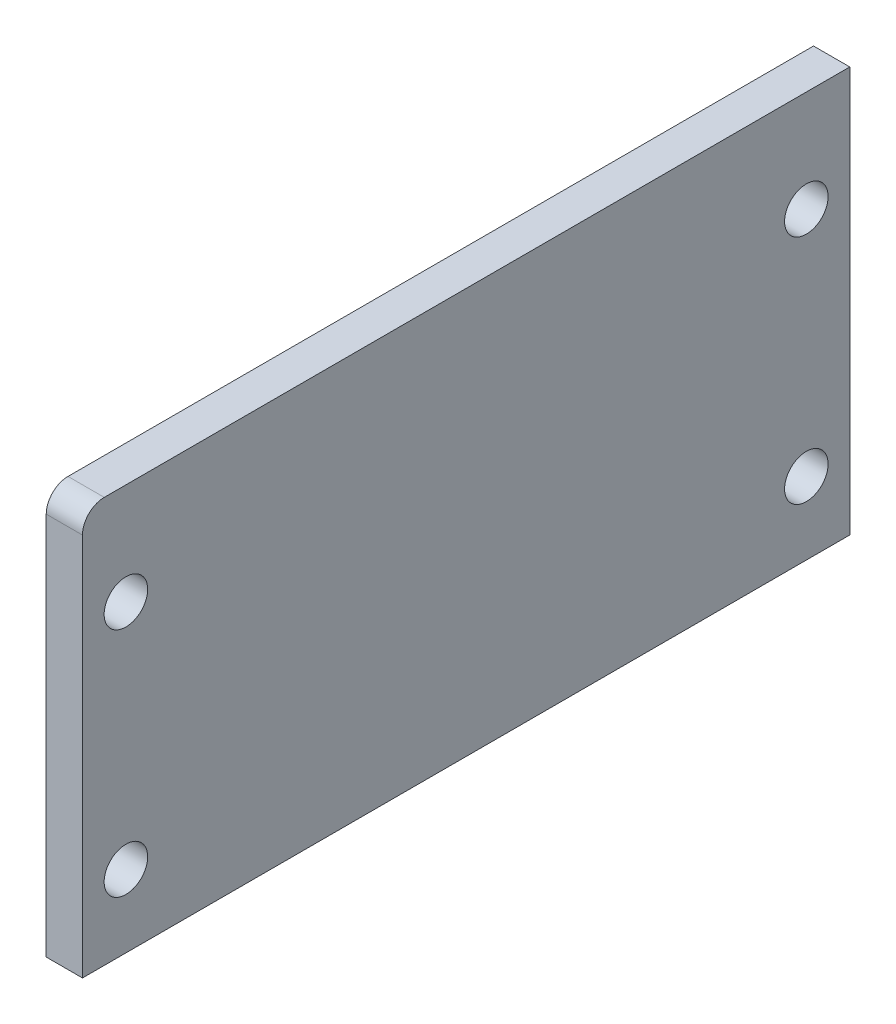
ISO-10303-21;
HEADER;
FILE_DESCRIPTION(('STEP AP214'),'2;1');
FILE_NAME('part.step','',(''),(''),'','','');
FILE_SCHEMA(('AUTOMOTIVE_DESIGN { 1 0 10303 214 1 1 1 1 }'));
ENDSEC;
DATA;
#1=APPLICATION_CONTEXT('core data for automotive mechanical design processes');
#2=APPLICATION_PROTOCOL_DEFINITION('international standard','automotive_design',2000,#1);
#3=PRODUCT_CONTEXT('',#1,'mechanical');
#4=PRODUCT('Part','Part','',(#3));
#5=PRODUCT_RELATED_PRODUCT_CATEGORY('part','',(#4));
#6=PRODUCT_DEFINITION_FORMATION('','',#4);
#7=PRODUCT_DEFINITION_CONTEXT('part definition',#1,'design');
#8=PRODUCT_DEFINITION('design','',#6,#7);
#9=PRODUCT_DEFINITION_SHAPE('','',#8);
#10=(LENGTH_UNIT() NAMED_UNIT(*) SI_UNIT(.MILLI.,.METRE.));
#11=(NAMED_UNIT(*) PLANE_ANGLE_UNIT() SI_UNIT($,.RADIAN.));
#12=(NAMED_UNIT(*) SI_UNIT($,.STERADIAN.) SOLID_ANGLE_UNIT());
#13=UNCERTAINTY_MEASURE_WITH_UNIT(LENGTH_MEASURE(1.E-05),#10,'distance_accuracy_value','');
#14=(GEOMETRIC_REPRESENTATION_CONTEXT(3) GLOBAL_UNCERTAINTY_ASSIGNED_CONTEXT((#13)) GLOBAL_UNIT_ASSIGNED_CONTEXT((#10,
#11,#12)) REPRESENTATION_CONTEXT('',''));
#15=CARTESIAN_POINT('',(0.,0.,0.));
#16=DIRECTION('',(0.,0.,1.));
#17=DIRECTION('',(1.,0.,0.));
#18=AXIS2_PLACEMENT_3D('',#15,#16,#17);
#19=CARTESIAN_POINT('',(3.18,35.56,0.));
#20=DIRECTION('',(0.,-1.,0.));
#21=DIRECTION('',(0.,0.,-1.));
#22=AXIS2_PLACEMENT_3D('',#19,#20,#21);
#23=PLANE('',#22);
#24=DIRECTION('',(0.,0.,1.));
#25=VECTOR('',#24,1.);
#26=CARTESIAN_POINT('',(0.,35.56,0.));
#27=LINE('',#26,#25);
#28=CARTESIAN_POINT('',(0.,35.56,0.));
#29=VERTEX_POINT('',#28);
#30=CARTESIAN_POINT('',(0.,35.56,65.4));
#31=VERTEX_POINT('',#30);
#32=EDGE_CURVE('E109',#29,#31,#27,.T.);
#33=ORIENTED_EDGE('',*,*,#32,.T.);
#34=DIRECTION('',(-1.,0.,0.));
#35=VECTOR('',#34,1.);
#36=CARTESIAN_POINT('',(3.18,35.56,65.4));
#37=LINE('',#36,#35);
#38=CARTESIAN_POINT('',(3.18,35.56,65.4));
#39=VERTEX_POINT('',#38);
#40=EDGE_CURVE('E11',#39,#31,#37,.T.);
#41=ORIENTED_EDGE('',*,*,#40,.F.);
#42=DIRECTION('',(0.,0.,1.));
#43=VECTOR('',#42,1.);
#44=CARTESIAN_POINT('',(3.18,35.56,0.));
#45=LINE('',#44,#43);
#46=CARTESIAN_POINT('',(3.18,35.56,0.));
#47=VERTEX_POINT('',#46);
#48=EDGE_CURVE('E120',#47,#39,#45,.T.);
#49=ORIENTED_EDGE('',*,*,#48,.F.);
#50=DIRECTION('',(-1.,0.,0.));
#51=VECTOR('',#50,1.);
#52=CARTESIAN_POINT('',(3.18,35.56,0.));
#53=LINE('',#52,#51);
#54=EDGE_CURVE('E105',#47,#29,#53,.T.);
#55=ORIENTED_EDGE('',*,*,#54,.T.);
#56=EDGE_LOOP('',(#33,#41,#49,#55));
#57=FACE_BOUND('',#56,.T.);
#58=ADVANCED_FACE('F37',(#57),#23,.F.);
#59=CARTESIAN_POINT('',(3.18,33.65,65.4));
#60=DIRECTION('',(-1.,0.,0.));
#61=DIRECTION('',(0.,0.,1.));
#62=AXIS2_PLACEMENT_3D('',#59,#60,#61);
#63=CYLINDRICAL_SURFACE('',#62,1.91000000000001);
#64=CARTESIAN_POINT('',(0.,33.65,65.4));
#65=DIRECTION('',(1.,0.,0.));
#66=DIRECTION('',(0.,0.,-1.));
#67=AXIS2_PLACEMENT_3D('',#64,#65,#66);
#68=CIRCLE('',#67,1.91000000000001);
#69=CARTESIAN_POINT('',(0.,33.65,67.31));
#70=VERTEX_POINT('',#69);
#71=EDGE_CURVE('E112',#31,#70,#68,.T.);
#72=ORIENTED_EDGE('',*,*,#71,.T.);
#73=DIRECTION('',(-1.,0.,0.));
#74=VECTOR('',#73,1.);
#75=CARTESIAN_POINT('',(3.18,33.65,67.31));
#76=LINE('',#75,#74);
#77=CARTESIAN_POINT('',(3.18,33.65,67.31));
#78=VERTEX_POINT('',#77);
#79=EDGE_CURVE('E45',#78,#70,#76,.T.);
#80=ORIENTED_EDGE('',*,*,#79,.F.);
#81=CARTESIAN_POINT('',(3.18,33.65,65.4));
#82=DIRECTION('',(1.,0.,0.));
#83=DIRECTION('',(0.,0.,-1.));
#84=AXIS2_PLACEMENT_3D('',#81,#82,#83);
#85=CIRCLE('',#84,1.91000000000001);
#86=EDGE_CURVE('E83',#39,#78,#85,.T.);
#87=ORIENTED_EDGE('',*,*,#86,.F.);
#88=ORIENTED_EDGE('',*,*,#40,.T.);
#89=EDGE_LOOP('',(#72,#80,#87,#88));
#90=FACE_BOUND('',#89,.T.);
#91=ADVANCED_FACE('F122',(#90),#63,.T.);
#92=CARTESIAN_POINT('',(3.18,0.,67.31));
#93=DIRECTION('',(0.,0.,1.));
#94=DIRECTION('',(1.,0.,0.));
#95=AXIS2_PLACEMENT_3D('',#92,#93,#94);
#96=PLANE('',#95);
#97=DIRECTION('',(0.,1.,0.));
#98=VECTOR('',#97,1.);
#99=CARTESIAN_POINT('',(0.,0.,67.31));
#100=LINE('',#99,#98);
#101=CARTESIAN_POINT('',(0.,0.,67.31));
#102=VERTEX_POINT('',#101);
#103=EDGE_CURVE('E94',#102,#70,#100,.T.);
#104=ORIENTED_EDGE('',*,*,#103,.F.);
#105=DIRECTION('',(-1.,0.,0.));
#106=VECTOR('',#105,1.);
#107=CARTESIAN_POINT('',(3.18,0.,67.31));
#108=LINE('',#107,#106);
#109=CARTESIAN_POINT('',(3.18,0.,67.31));
#110=VERTEX_POINT('',#109);
#111=EDGE_CURVE('E89',#110,#102,#108,.T.);
#112=ORIENTED_EDGE('',*,*,#111,.F.);
#113=DIRECTION('',(0.,1.,0.));
#114=VECTOR('',#113,1.);
#115=CARTESIAN_POINT('',(3.18,0.,67.31));
#116=LINE('',#115,#114);
#117=EDGE_CURVE('E92',#110,#78,#116,.T.);
#118=ORIENTED_EDGE('',*,*,#117,.T.);
#119=ORIENTED_EDGE('',*,*,#79,.T.);
#120=EDGE_LOOP('',(#104,#112,#118,#119));
#121=FACE_BOUND('',#120,.T.);
#122=ADVANCED_FACE('F91',(#121),#96,.T.);
#123=CARTESIAN_POINT('',(3.18,0.,0.));
#124=DIRECTION('',(0.,-1.,0.));
#125=DIRECTION('',(0.,0.,-1.));
#126=AXIS2_PLACEMENT_3D('',#123,#124,#125);
#127=PLANE('',#126);
#128=DIRECTION('',(0.,0.,1.));
#129=VECTOR('',#128,1.);
#130=CARTESIAN_POINT('',(0.,0.,0.));
#131=LINE('',#130,#129);
#132=CARTESIAN_POINT('',(0.,0.,0.));
#133=VERTEX_POINT('',#132);
#134=EDGE_CURVE('E117',#133,#102,#131,.T.);
#135=ORIENTED_EDGE('',*,*,#134,.F.);
#136=DIRECTION('',(-1.,0.,0.));
#137=VECTOR('',#136,1.);
#138=CARTESIAN_POINT('',(3.18,0.,0.));
#139=LINE('',#138,#137);
#140=CARTESIAN_POINT('',(3.18,0.,0.));
#141=VERTEX_POINT('',#140);
#142=EDGE_CURVE('E72',#141,#133,#139,.T.);
#143=ORIENTED_EDGE('',*,*,#142,.F.);
#144=DIRECTION('',(0.,0.,1.));
#145=VECTOR('',#144,1.);
#146=CARTESIAN_POINT('',(3.18,0.,0.));
#147=LINE('',#146,#145);
#148=EDGE_CURVE('E101',#141,#110,#147,.T.);
#149=ORIENTED_EDGE('',*,*,#148,.T.);
#150=ORIENTED_EDGE('',*,*,#111,.T.);
#151=EDGE_LOOP('',(#135,#143,#149,#150));
#152=FACE_BOUND('',#151,.T.);
#153=ADVANCED_FACE('F103',(#152),#127,.T.);
#154=CARTESIAN_POINT('',(3.18,0.,0.));
#155=DIRECTION('',(0.,0.,1.));
#156=DIRECTION('',(1.,0.,0.));
#157=AXIS2_PLACEMENT_3D('',#154,#155,#156);
#158=PLANE('',#157);
#159=DIRECTION('',(0.,1.,0.));
#160=VECTOR('',#159,1.);
#161=CARTESIAN_POINT('',(0.,0.,0.));
#162=LINE('',#161,#160);
#163=EDGE_CURVE('E75',#133,#29,#162,.T.);
#164=ORIENTED_EDGE('',*,*,#163,.T.);
#165=ORIENTED_EDGE('',*,*,#54,.F.);
#166=DIRECTION('',(0.,1.,0.));
#167=VECTOR('',#166,1.);
#168=CARTESIAN_POINT('',(3.18,0.,0.));
#169=LINE('',#168,#167);
#170=EDGE_CURVE('E53',#141,#47,#169,.T.);
#171=ORIENTED_EDGE('',*,*,#170,.F.);
#172=ORIENTED_EDGE('',*,*,#142,.T.);
#173=EDGE_LOOP('',(#164,#165,#171,#172));
#174=FACE_BOUND('',#173,.T.);
#175=ADVANCED_FACE('F129',(#174),#158,.F.);
#176=CARTESIAN_POINT('',(3.18,33.65,65.4));
#177=DIRECTION('',(1.,0.,0.));
#178=DIRECTION('',(0.,0.,-1.));
#179=AXIS2_PLACEMENT_3D('',#176,#177,#178);
#180=PLANE('',#179);
#181=CARTESIAN_POINT('',(3.18,26.67,3.81));
#182=DIRECTION('',(1.,0.,0.));
#183=DIRECTION('',(0.,0.,-1.));
#184=AXIS2_PLACEMENT_3D('',#181,#182,#183);
#185=CIRCLE('',#184,1.91);
#186=CARTESIAN_POINT('',(3.18,26.67,1.9));
#187=VERTEX_POINT('',#186);
#188=EDGE_CURVE('E222',#187,#187,#185,.T.);
#189=ORIENTED_EDGE('',*,*,#188,.F.);
#190=EDGE_LOOP('',(#189));
#191=FACE_BOUND('',#190,.T.);
#192=CARTESIAN_POINT('',(3.18,6.35,3.81));
#193=DIRECTION('',(1.,0.,0.));
#194=DIRECTION('',(0.,0.,-1.));
#195=AXIS2_PLACEMENT_3D('',#192,#193,#194);
#196=CIRCLE('',#195,1.91);
#197=CARTESIAN_POINT('',(3.18,6.35,1.9));
#198=VERTEX_POINT('',#197);
#199=EDGE_CURVE('E224',#198,#198,#196,.T.);
#200=ORIENTED_EDGE('',*,*,#199,.F.);
#201=EDGE_LOOP('',(#200));
#202=FACE_BOUND('',#201,.T.);
#203=CARTESIAN_POINT('',(3.18,6.35,63.5));
#204=DIRECTION('',(1.,0.,0.));
#205=DIRECTION('',(0.,0.,-1.));
#206=AXIS2_PLACEMENT_3D('',#203,#204,#205);
#207=CIRCLE('',#206,1.91);
#208=CARTESIAN_POINT('',(3.18,6.35,61.59));
#209=VERTEX_POINT('',#208);
#210=EDGE_CURVE('E237',#209,#209,#207,.T.);
#211=ORIENTED_EDGE('',*,*,#210,.F.);
#212=EDGE_LOOP('',(#211));
#213=FACE_BOUND('',#212,.T.);
#214=CARTESIAN_POINT('',(3.18,26.67,63.5));
#215=DIRECTION('',(1.,0.,0.));
#216=DIRECTION('',(0.,0.,-1.));
#217=AXIS2_PLACEMENT_3D('',#214,#215,#216);
#218=CIRCLE('',#217,1.91);
#219=CARTESIAN_POINT('',(3.18,26.67,61.59));
#220=VERTEX_POINT('',#219);
#221=EDGE_CURVE('E230',#220,#220,#218,.T.);
#222=ORIENTED_EDGE('',*,*,#221,.F.);
#223=EDGE_LOOP('',(#222));
#224=FACE_BOUND('',#223,.T.);
#225=ORIENTED_EDGE('',*,*,#48,.T.);
#226=ORIENTED_EDGE('',*,*,#86,.T.);
#227=ORIENTED_EDGE('',*,*,#117,.F.);
#228=ORIENTED_EDGE('',*,*,#148,.F.);
#229=ORIENTED_EDGE('',*,*,#170,.T.);
#230=EDGE_LOOP('',(#225,#226,#227,#228,#229));
#231=FACE_BOUND('',#230,.T.);
#232=ADVANCED_FACE('F100',(#191,#202,#213,#224,#231),#180,.T.);
#233=CARTESIAN_POINT('',(0.,33.65,65.4));
#234=DIRECTION('',(1.,0.,0.));
#235=DIRECTION('',(0.,0.,-1.));
#236=AXIS2_PLACEMENT_3D('',#233,#234,#235);
#237=PLANE('',#236);
#238=CARTESIAN_POINT('',(0.,26.67,3.81));
#239=DIRECTION('',(1.,0.,0.));
#240=DIRECTION('',(0.,0.,-1.));
#241=AXIS2_PLACEMENT_3D('',#238,#239,#240);
#242=CIRCLE('',#241,1.91);
#243=CARTESIAN_POINT('',(0.,26.67,1.9));
#244=VERTEX_POINT('',#243);
#245=EDGE_CURVE('E219',#244,#244,#242,.T.);
#246=ORIENTED_EDGE('',*,*,#245,.T.);
#247=EDGE_LOOP('',(#246));
#248=FACE_BOUND('',#247,.T.);
#249=CARTESIAN_POINT('',(0.,6.35,3.81));
#250=DIRECTION('',(1.,0.,0.));
#251=DIRECTION('',(0.,0.,-1.));
#252=AXIS2_PLACEMENT_3D('',#249,#250,#251);
#253=CIRCLE('',#252,1.91);
#254=CARTESIAN_POINT('',(0.,6.35,1.9));
#255=VERTEX_POINT('',#254);
#256=EDGE_CURVE('E242',#255,#255,#253,.T.);
#257=ORIENTED_EDGE('',*,*,#256,.T.);
#258=EDGE_LOOP('',(#257));
#259=FACE_BOUND('',#258,.T.);
#260=CARTESIAN_POINT('',(0.,6.35,63.5));
#261=DIRECTION('',(1.,0.,0.));
#262=DIRECTION('',(0.,0.,-1.));
#263=AXIS2_PLACEMENT_3D('',#260,#261,#262);
#264=CIRCLE('',#263,1.91);
#265=CARTESIAN_POINT('',(0.,6.35,61.59));
#266=VERTEX_POINT('',#265);
#267=EDGE_CURVE('E233',#266,#266,#264,.T.);
#268=ORIENTED_EDGE('',*,*,#267,.T.);
#269=EDGE_LOOP('',(#268));
#270=FACE_BOUND('',#269,.T.);
#271=CARTESIAN_POINT('',(0.,26.67,63.5));
#272=DIRECTION('',(1.,0.,0.));
#273=DIRECTION('',(0.,0.,-1.));
#274=AXIS2_PLACEMENT_3D('',#271,#272,#273);
#275=CIRCLE('',#274,1.91);
#276=CARTESIAN_POINT('',(0.,26.67,61.59));
#277=VERTEX_POINT('',#276);
#278=EDGE_CURVE('E113',#277,#277,#275,.T.);
#279=ORIENTED_EDGE('',*,*,#278,.T.);
#280=EDGE_LOOP('',(#279));
#281=FACE_BOUND('',#280,.T.);
#282=ORIENTED_EDGE('',*,*,#32,.F.);
#283=ORIENTED_EDGE('',*,*,#163,.F.);
#284=ORIENTED_EDGE('',*,*,#134,.T.);
#285=ORIENTED_EDGE('',*,*,#103,.T.);
#286=ORIENTED_EDGE('',*,*,#71,.F.);
#287=EDGE_LOOP('',(#282,#283,#284,#285,#286));
#288=FACE_BOUND('',#287,.T.);
#289=ADVANCED_FACE('F126',(#248,#259,#270,#281,#288),#237,.F.);
#290=CARTESIAN_POINT('',(0.,26.67,63.5));
#291=DIRECTION('',(1.,0.,0.));
#292=DIRECTION('',(0.,0.,-1.));
#293=AXIS2_PLACEMENT_3D('',#290,#291,#292);
#294=CYLINDRICAL_SURFACE('',#293,1.91);
#295=CARTESIAN_POINT('',(0.,26.67,61.59));
#296=CARTESIAN_POINT('',(0.033125,26.67,61.59));
#297=CARTESIAN_POINT('',(0.06625,26.67,61.59));
#298=CARTESIAN_POINT('',(0.1325,26.67,61.59));
#299=CARTESIAN_POINT('',(0.165625,26.67,61.59));
#300=CARTESIAN_POINT('',(0.231875,26.67,61.59));
#301=CARTESIAN_POINT('',(0.265,26.67,61.59));
#302=CARTESIAN_POINT('',(0.33125,26.67,61.59));
#303=CARTESIAN_POINT('',(0.364375,26.67,61.59));
#304=CARTESIAN_POINT('',(0.430625,26.67,61.59));
#305=CARTESIAN_POINT('',(0.46375,26.67,61.59));
#306=CARTESIAN_POINT('',(0.53,26.67,61.59));
#307=CARTESIAN_POINT('',(0.563125,26.67,61.59));
#308=CARTESIAN_POINT('',(0.629375,26.67,61.59));
#309=CARTESIAN_POINT('',(0.6625,26.67,61.59));
#310=CARTESIAN_POINT('',(0.72875,26.67,61.59));
#311=CARTESIAN_POINT('',(0.761875,26.67,61.59));
#312=CARTESIAN_POINT('',(0.828125,26.67,61.59));
#313=CARTESIAN_POINT('',(0.86125,26.67,61.59));
#314=CARTESIAN_POINT('',(0.9275,26.67,61.59));
#315=CARTESIAN_POINT('',(0.960625,26.67,61.59));
#316=CARTESIAN_POINT('',(1.026875,26.67,61.59));
#317=CARTESIAN_POINT('',(1.06,26.67,61.59));
#318=CARTESIAN_POINT('',(1.12625,26.67,61.59));
#319=CARTESIAN_POINT('',(1.159375,26.67,61.59));
#320=CARTESIAN_POINT('',(1.225625,26.67,61.59));
#321=CARTESIAN_POINT('',(1.25875,26.67,61.59));
#322=CARTESIAN_POINT('',(1.325,26.67,61.59));
#323=CARTESIAN_POINT('',(1.358125,26.67,61.59));
#324=CARTESIAN_POINT('',(1.424375,26.67,61.59));
#325=CARTESIAN_POINT('',(1.4575,26.67,61.59));
#326=CARTESIAN_POINT('',(1.52375,26.67,61.59));
#327=CARTESIAN_POINT('',(1.556875,26.67,61.59));
#328=CARTESIAN_POINT('',(1.623125,26.67,61.59));
#329=CARTESIAN_POINT('',(1.65625,26.67,61.59));
#330=CARTESIAN_POINT('',(1.7225,26.67,61.59));
#331=CARTESIAN_POINT('',(1.755625,26.67,61.59));
#332=CARTESIAN_POINT('',(1.821875,26.67,61.59));
#333=CARTESIAN_POINT('',(1.855,26.67,61.59));
#334=CARTESIAN_POINT('',(1.92125,26.67,61.59));
#335=CARTESIAN_POINT('',(1.954375,26.67,61.59));
#336=CARTESIAN_POINT('',(2.020625,26.67,61.59));
#337=CARTESIAN_POINT('',(2.05375,26.67,61.59));
#338=CARTESIAN_POINT('',(2.12,26.67,61.59));
#339=CARTESIAN_POINT('',(2.153125,26.67,61.59));
#340=CARTESIAN_POINT('',(2.219375,26.67,61.59));
#341=CARTESIAN_POINT('',(2.2525,26.67,61.59));
#342=CARTESIAN_POINT('',(2.31875,26.67,61.59));
#343=CARTESIAN_POINT('',(2.351875,26.67,61.59));
#344=CARTESIAN_POINT('',(2.418125,26.67,61.59));
#345=CARTESIAN_POINT('',(2.45125,26.67,61.59));
#346=CARTESIAN_POINT('',(2.5175,26.67,61.59));
#347=CARTESIAN_POINT('',(2.550625,26.67,61.59));
#348=CARTESIAN_POINT('',(2.616875,26.67,61.59));
#349=CARTESIAN_POINT('',(2.65,26.67,61.59));
#350=CARTESIAN_POINT('',(2.71625,26.67,61.59));
#351=CARTESIAN_POINT('',(2.749375,26.67,61.59));
#352=CARTESIAN_POINT('',(2.815625,26.67,61.59));
#353=CARTESIAN_POINT('',(2.84875,26.67,61.59));
#354=CARTESIAN_POINT('',(2.915,26.67,61.59));
#355=CARTESIAN_POINT('',(2.948125,26.67,61.59));
#356=CARTESIAN_POINT('',(3.014375,26.67,61.59));
#357=CARTESIAN_POINT('',(3.0475,26.67,61.59));
#358=CARTESIAN_POINT('',(3.11375,26.67,61.59));
#359=CARTESIAN_POINT('',(3.146875,26.67,61.59));
#360=CARTESIAN_POINT('',(3.18,26.67,61.59));
#361=B_SPLINE_CURVE_WITH_KNOTS('',3,(#295,#296,#297,#298,#299,#300,#301,#302,#303,#304,#305,
#306,#307,#308,#309,#310,#311,#312,#313,#314,#315,#316,#317,#318,#319,#320,#321,#322,#323,#324,
#325,#326,#327,#328,#329,#330,#331,#332,#333,#334,#335,#336,#337,#338,#339,#340,#341,#342,#343,
#344,#345,#346,#347,#348,#349,#350,#351,#352,#353,#354,#355,#356,#357,#358,#359,#360),
.UNSPECIFIED.,.F.,.F.,(4,2,2,2,2,2,2,2,2,2,2,2,2,2,2,2,2,2,2,2,2,2,2,2,2,2,2,2,2,2,2,2,4),(0.,
0.099375,0.19875,0.298125,0.3975,0.496875,0.59625,0.695625,0.795,0.894375,0.99375,1.093125,
1.1925,1.291875,1.39125,1.490625,1.59,1.689375,1.78875,1.888125,1.9875,2.086875,2.18625,
2.285625,2.385,2.484375,2.58375,2.683125,2.7825,2.881875,2.98125,3.080625,3.18),.UNSPECIFIED.);
#362=EDGE_CURVE('BSEAM173',#277,#220,#361,.T.);
#363=ORIENTED_EDGE('',*,*,#278,.F.);
#364=ORIENTED_EDGE('',*,*,#221,.T.);
#365=ORIENTED_EDGE('',*,*,#362,.T.);
#366=ORIENTED_EDGE('',*,*,#362,.F.);
#367=EDGE_LOOP('',(#363,#365,#364,#366));
#368=FACE_BOUND('',#367,.T.);
#369=ADVANCED_FACE('F173',(#368),#294,.F.);
#370=CARTESIAN_POINT('',(0.,6.35,63.5));
#371=DIRECTION('',(1.,0.,0.));
#372=DIRECTION('',(0.,0.,-1.));
#373=AXIS2_PLACEMENT_3D('',#370,#371,#372);
#374=CYLINDRICAL_SURFACE('',#373,1.91);
#375=CARTESIAN_POINT('',(0.,6.35,61.59));
#376=CARTESIAN_POINT('',(0.033125,6.35,61.59));
#377=CARTESIAN_POINT('',(0.06625,6.35,61.59));
#378=CARTESIAN_POINT('',(0.1325,6.35,61.59));
#379=CARTESIAN_POINT('',(0.165625,6.35,61.59));
#380=CARTESIAN_POINT('',(0.231875,6.35,61.59));
#381=CARTESIAN_POINT('',(0.265,6.35,61.59));
#382=CARTESIAN_POINT('',(0.33125,6.35,61.59));
#383=CARTESIAN_POINT('',(0.364375,6.35,61.59));
#384=CARTESIAN_POINT('',(0.430625,6.35,61.59));
#385=CARTESIAN_POINT('',(0.46375,6.35,61.59));
#386=CARTESIAN_POINT('',(0.53,6.35,61.59));
#387=CARTESIAN_POINT('',(0.563125,6.35,61.59));
#388=CARTESIAN_POINT('',(0.629375,6.35,61.59));
#389=CARTESIAN_POINT('',(0.6625,6.35,61.59));
#390=CARTESIAN_POINT('',(0.72875,6.35,61.59));
#391=CARTESIAN_POINT('',(0.761875,6.35,61.59));
#392=CARTESIAN_POINT('',(0.828125,6.35,61.59));
#393=CARTESIAN_POINT('',(0.86125,6.35,61.59));
#394=CARTESIAN_POINT('',(0.9275,6.35,61.59));
#395=CARTESIAN_POINT('',(0.960625,6.35,61.59));
#396=CARTESIAN_POINT('',(1.026875,6.35,61.59));
#397=CARTESIAN_POINT('',(1.06,6.35,61.59));
#398=CARTESIAN_POINT('',(1.12625,6.35,61.59));
#399=CARTESIAN_POINT('',(1.159375,6.35,61.59));
#400=CARTESIAN_POINT('',(1.225625,6.35,61.59));
#401=CARTESIAN_POINT('',(1.25875,6.35,61.59));
#402=CARTESIAN_POINT('',(1.325,6.35,61.59));
#403=CARTESIAN_POINT('',(1.358125,6.35,61.59));
#404=CARTESIAN_POINT('',(1.424375,6.35,61.59));
#405=CARTESIAN_POINT('',(1.4575,6.35,61.59));
#406=CARTESIAN_POINT('',(1.52375,6.35,61.59));
#407=CARTESIAN_POINT('',(1.556875,6.35,61.59));
#408=CARTESIAN_POINT('',(1.623125,6.35,61.59));
#409=CARTESIAN_POINT('',(1.65625,6.35,61.59));
#410=CARTESIAN_POINT('',(1.7225,6.35,61.59));
#411=CARTESIAN_POINT('',(1.755625,6.35,61.59));
#412=CARTESIAN_POINT('',(1.821875,6.35,61.59));
#413=CARTESIAN_POINT('',(1.855,6.35,61.59));
#414=CARTESIAN_POINT('',(1.92125,6.35,61.59));
#415=CARTESIAN_POINT('',(1.954375,6.35,61.59));
#416=CARTESIAN_POINT('',(2.020625,6.35,61.59));
#417=CARTESIAN_POINT('',(2.05375,6.35,61.59));
#418=CARTESIAN_POINT('',(2.12,6.35,61.59));
#419=CARTESIAN_POINT('',(2.153125,6.35,61.59));
#420=CARTESIAN_POINT('',(2.219375,6.35,61.59));
#421=CARTESIAN_POINT('',(2.2525,6.35,61.59));
#422=CARTESIAN_POINT('',(2.31875,6.35,61.59));
#423=CARTESIAN_POINT('',(2.351875,6.35,61.59));
#424=CARTESIAN_POINT('',(2.418125,6.35,61.59));
#425=CARTESIAN_POINT('',(2.45125,6.35,61.59));
#426=CARTESIAN_POINT('',(2.5175,6.35,61.59));
#427=CARTESIAN_POINT('',(2.550625,6.35,61.59));
#428=CARTESIAN_POINT('',(2.616875,6.35,61.59));
#429=CARTESIAN_POINT('',(2.65,6.35,61.59));
#430=CARTESIAN_POINT('',(2.71625,6.35,61.59));
#431=CARTESIAN_POINT('',(2.749375,6.35,61.59));
#432=CARTESIAN_POINT('',(2.815625,6.35,61.59));
#433=CARTESIAN_POINT('',(2.84875,6.35,61.59));
#434=CARTESIAN_POINT('',(2.915,6.35,61.59));
#435=CARTESIAN_POINT('',(2.948125,6.35,61.59));
#436=CARTESIAN_POINT('',(3.014375,6.35,61.59));
#437=CARTESIAN_POINT('',(3.0475,6.35,61.59));
#438=CARTESIAN_POINT('',(3.11375,6.35,61.59));
#439=CARTESIAN_POINT('',(3.146875,6.35,61.59));
#440=CARTESIAN_POINT('',(3.18,6.35,61.59));
#441=B_SPLINE_CURVE_WITH_KNOTS('',3,(#375,#376,#377,#378,#379,#380,#381,#382,#383,#384,#385,
#386,#387,#388,#389,#390,#391,#392,#393,#394,#395,#396,#397,#398,#399,#400,#401,#402,#403,#404,
#405,#406,#407,#408,#409,#410,#411,#412,#413,#414,#415,#416,#417,#418,#419,#420,#421,#422,#423,
#424,#425,#426,#427,#428,#429,#430,#431,#432,#433,#434,#435,#436,#437,#438,#439,#440),
.UNSPECIFIED.,.F.,.F.,(4,2,2,2,2,2,2,2,2,2,2,2,2,2,2,2,2,2,2,2,2,2,2,2,2,2,2,2,2,2,2,2,4),(0.,
0.099375,0.19875,0.298125,0.3975,0.496875,0.59625,0.695625,0.795,0.894375,0.99375,1.093125,
1.1925,1.291875,1.39125,1.490625,1.59,1.689375,1.78875,1.888125,1.9875,2.086875,2.18625,
2.285625,2.385,2.484375,2.58375,2.683125,2.7825,2.881875,2.98125,3.080625,3.18),.UNSPECIFIED.);
#442=EDGE_CURVE('BSEAM182',#266,#209,#441,.T.);
#443=ORIENTED_EDGE('',*,*,#267,.F.);
#444=ORIENTED_EDGE('',*,*,#210,.T.);
#445=ORIENTED_EDGE('',*,*,#442,.T.);
#446=ORIENTED_EDGE('',*,*,#442,.F.);
#447=EDGE_LOOP('',(#443,#445,#444,#446));
#448=FACE_BOUND('',#447,.T.);
#449=ADVANCED_FACE('F182',(#448),#374,.F.);
#450=CARTESIAN_POINT('',(0.,6.35,3.81));
#451=DIRECTION('',(1.,0.,0.));
#452=DIRECTION('',(0.,0.,-1.));
#453=AXIS2_PLACEMENT_3D('',#450,#451,#452);
#454=CYLINDRICAL_SURFACE('',#453,1.91);
#455=CARTESIAN_POINT('',(0.,6.35,1.9));
#456=CARTESIAN_POINT('',(0.033125,6.35,1.9));
#457=CARTESIAN_POINT('',(0.06625,6.35,1.9));
#458=CARTESIAN_POINT('',(0.1325,6.35,1.9));
#459=CARTESIAN_POINT('',(0.165625,6.35,1.9));
#460=CARTESIAN_POINT('',(0.231875,6.35,1.9));
#461=CARTESIAN_POINT('',(0.265,6.35,1.9));
#462=CARTESIAN_POINT('',(0.33125,6.35,1.9));
#463=CARTESIAN_POINT('',(0.364375,6.35,1.9));
#464=CARTESIAN_POINT('',(0.430625,6.35,1.9));
#465=CARTESIAN_POINT('',(0.46375,6.35,1.9));
#466=CARTESIAN_POINT('',(0.53,6.35,1.9));
#467=CARTESIAN_POINT('',(0.563125,6.35,1.9));
#468=CARTESIAN_POINT('',(0.629375,6.35,1.9));
#469=CARTESIAN_POINT('',(0.6625,6.35,1.9));
#470=CARTESIAN_POINT('',(0.72875,6.35,1.9));
#471=CARTESIAN_POINT('',(0.761875,6.35,1.9));
#472=CARTESIAN_POINT('',(0.828125,6.35,1.9));
#473=CARTESIAN_POINT('',(0.86125,6.35,1.9));
#474=CARTESIAN_POINT('',(0.9275,6.35,1.9));
#475=CARTESIAN_POINT('',(0.960625,6.35,1.9));
#476=CARTESIAN_POINT('',(1.026875,6.35,1.9));
#477=CARTESIAN_POINT('',(1.06,6.35,1.9));
#478=CARTESIAN_POINT('',(1.12625,6.35,1.9));
#479=CARTESIAN_POINT('',(1.159375,6.35,1.9));
#480=CARTESIAN_POINT('',(1.225625,6.35,1.9));
#481=CARTESIAN_POINT('',(1.25875,6.35,1.9));
#482=CARTESIAN_POINT('',(1.325,6.35,1.9));
#483=CARTESIAN_POINT('',(1.358125,6.35,1.9));
#484=CARTESIAN_POINT('',(1.424375,6.35,1.9));
#485=CARTESIAN_POINT('',(1.4575,6.35,1.9));
#486=CARTESIAN_POINT('',(1.52375,6.35,1.9));
#487=CARTESIAN_POINT('',(1.556875,6.35,1.9));
#488=CARTESIAN_POINT('',(1.623125,6.35,1.9));
#489=CARTESIAN_POINT('',(1.65625,6.35,1.9));
#490=CARTESIAN_POINT('',(1.7225,6.35,1.9));
#491=CARTESIAN_POINT('',(1.755625,6.35,1.9));
#492=CARTESIAN_POINT('',(1.821875,6.35,1.9));
#493=CARTESIAN_POINT('',(1.855,6.35,1.9));
#494=CARTESIAN_POINT('',(1.92125,6.35,1.9));
#495=CARTESIAN_POINT('',(1.954375,6.35,1.9));
#496=CARTESIAN_POINT('',(2.020625,6.35,1.9));
#497=CARTESIAN_POINT('',(2.05375,6.35,1.9));
#498=CARTESIAN_POINT('',(2.12,6.35,1.9));
#499=CARTESIAN_POINT('',(2.153125,6.35,1.9));
#500=CARTESIAN_POINT('',(2.219375,6.35,1.9));
#501=CARTESIAN_POINT('',(2.2525,6.35,1.9));
#502=CARTESIAN_POINT('',(2.31875,6.35,1.9));
#503=CARTESIAN_POINT('',(2.351875,6.35,1.9));
#504=CARTESIAN_POINT('',(2.418125,6.35,1.9));
#505=CARTESIAN_POINT('',(2.45125,6.35,1.9));
#506=CARTESIAN_POINT('',(2.5175,6.35,1.9));
#507=CARTESIAN_POINT('',(2.550625,6.35,1.9));
#508=CARTESIAN_POINT('',(2.616875,6.35,1.9));
#509=CARTESIAN_POINT('',(2.65,6.35,1.9));
#510=CARTESIAN_POINT('',(2.71625,6.35,1.9));
#511=CARTESIAN_POINT('',(2.749375,6.35,1.9));
#512=CARTESIAN_POINT('',(2.815625,6.35,1.9));
#513=CARTESIAN_POINT('',(2.84875,6.35,1.9));
#514=CARTESIAN_POINT('',(2.915,6.35,1.9));
#515=CARTESIAN_POINT('',(2.948125,6.35,1.9));
#516=CARTESIAN_POINT('',(3.014375,6.35,1.9));
#517=CARTESIAN_POINT('',(3.0475,6.35,1.9));
#518=CARTESIAN_POINT('',(3.11375,6.35,1.9));
#519=CARTESIAN_POINT('',(3.146875,6.35,1.9));
#520=CARTESIAN_POINT('',(3.18,6.35,1.9));
#521=B_SPLINE_CURVE_WITH_KNOTS('',3,(#455,#456,#457,#458,#459,#460,#461,#462,#463,#464,#465,
#466,#467,#468,#469,#470,#471,#472,#473,#474,#475,#476,#477,#478,#479,#480,#481,#482,#483,#484,
#485,#486,#487,#488,#489,#490,#491,#492,#493,#494,#495,#496,#497,#498,#499,#500,#501,#502,#503,
#504,#505,#506,#507,#508,#509,#510,#511,#512,#513,#514,#515,#516,#517,#518,#519,#520),
.UNSPECIFIED.,.F.,.F.,(4,2,2,2,2,2,2,2,2,2,2,2,2,2,2,2,2,2,2,2,2,2,2,2,2,2,2,2,2,2,2,2,4),(0.,
0.099375,0.19875,0.298125,0.3975,0.496875,0.59625,0.695625,0.795,0.894375,0.99375,1.093125,
1.1925,1.291875,1.39125,1.490625,1.59,1.689375,1.78875,1.888125,1.9875,2.086875,2.18625,
2.285625,2.385,2.484375,2.58375,2.683125,2.7825,2.881875,2.98125,3.080625,3.18),.UNSPECIFIED.);
#522=EDGE_CURVE('BSEAM192',#255,#198,#521,.T.);
#523=ORIENTED_EDGE('',*,*,#256,.F.);
#524=ORIENTED_EDGE('',*,*,#199,.T.);
#525=ORIENTED_EDGE('',*,*,#522,.T.);
#526=ORIENTED_EDGE('',*,*,#522,.F.);
#527=EDGE_LOOP('',(#523,#525,#524,#526));
#528=FACE_BOUND('',#527,.T.);
#529=ADVANCED_FACE('F192',(#528),#454,.F.);
#530=CARTESIAN_POINT('',(0.,26.67,3.81));
#531=DIRECTION('',(1.,0.,0.));
#532=DIRECTION('',(0.,0.,-1.));
#533=AXIS2_PLACEMENT_3D('',#530,#531,#532);
#534=CYLINDRICAL_SURFACE('',#533,1.91);
#535=CARTESIAN_POINT('',(0.,26.67,1.9));
#536=CARTESIAN_POINT('',(0.033125,26.67,1.9));
#537=CARTESIAN_POINT('',(0.06625,26.67,1.9));
#538=CARTESIAN_POINT('',(0.1325,26.67,1.9));
#539=CARTESIAN_POINT('',(0.165625,26.67,1.9));
#540=CARTESIAN_POINT('',(0.231875,26.67,1.9));
#541=CARTESIAN_POINT('',(0.265,26.67,1.9));
#542=CARTESIAN_POINT('',(0.33125,26.67,1.9));
#543=CARTESIAN_POINT('',(0.364375,26.67,1.9));
#544=CARTESIAN_POINT('',(0.430625,26.67,1.9));
#545=CARTESIAN_POINT('',(0.46375,26.67,1.9));
#546=CARTESIAN_POINT('',(0.53,26.67,1.9));
#547=CARTESIAN_POINT('',(0.563125,26.67,1.9));
#548=CARTESIAN_POINT('',(0.629375,26.67,1.9));
#549=CARTESIAN_POINT('',(0.6625,26.67,1.9));
#550=CARTESIAN_POINT('',(0.72875,26.67,1.9));
#551=CARTESIAN_POINT('',(0.761875,26.67,1.9));
#552=CARTESIAN_POINT('',(0.828125,26.67,1.9));
#553=CARTESIAN_POINT('',(0.86125,26.67,1.9));
#554=CARTESIAN_POINT('',(0.9275,26.67,1.9));
#555=CARTESIAN_POINT('',(0.960625,26.67,1.9));
#556=CARTESIAN_POINT('',(1.026875,26.67,1.9));
#557=CARTESIAN_POINT('',(1.06,26.67,1.9));
#558=CARTESIAN_POINT('',(1.12625,26.67,1.9));
#559=CARTESIAN_POINT('',(1.159375,26.67,1.9));
#560=CARTESIAN_POINT('',(1.225625,26.67,1.9));
#561=CARTESIAN_POINT('',(1.25875,26.67,1.9));
#562=CARTESIAN_POINT('',(1.325,26.67,1.9));
#563=CARTESIAN_POINT('',(1.358125,26.67,1.9));
#564=CARTESIAN_POINT('',(1.424375,26.67,1.9));
#565=CARTESIAN_POINT('',(1.4575,26.67,1.9));
#566=CARTESIAN_POINT('',(1.52375,26.67,1.9));
#567=CARTESIAN_POINT('',(1.556875,26.67,1.9));
#568=CARTESIAN_POINT('',(1.623125,26.67,1.9));
#569=CARTESIAN_POINT('',(1.65625,26.67,1.9));
#570=CARTESIAN_POINT('',(1.7225,26.67,1.9));
#571=CARTESIAN_POINT('',(1.755625,26.67,1.9));
#572=CARTESIAN_POINT('',(1.821875,26.67,1.9));
#573=CARTESIAN_POINT('',(1.855,26.67,1.9));
#574=CARTESIAN_POINT('',(1.92125,26.67,1.9));
#575=CARTESIAN_POINT('',(1.954375,26.67,1.9));
#576=CARTESIAN_POINT('',(2.020625,26.67,1.9));
#577=CARTESIAN_POINT('',(2.05375,26.67,1.9));
#578=CARTESIAN_POINT('',(2.12,26.67,1.9));
#579=CARTESIAN_POINT('',(2.153125,26.67,1.9));
#580=CARTESIAN_POINT('',(2.219375,26.67,1.9));
#581=CARTESIAN_POINT('',(2.2525,26.67,1.9));
#582=CARTESIAN_POINT('',(2.31875,26.67,1.9));
#583=CARTESIAN_POINT('',(2.351875,26.67,1.9));
#584=CARTESIAN_POINT('',(2.418125,26.67,1.9));
#585=CARTESIAN_POINT('',(2.45125,26.67,1.9));
#586=CARTESIAN_POINT('',(2.5175,26.67,1.9));
#587=CARTESIAN_POINT('',(2.550625,26.67,1.9));
#588=CARTESIAN_POINT('',(2.616875,26.67,1.9));
#589=CARTESIAN_POINT('',(2.65,26.67,1.9));
#590=CARTESIAN_POINT('',(2.71625,26.67,1.9));
#591=CARTESIAN_POINT('',(2.749375,26.67,1.9));
#592=CARTESIAN_POINT('',(2.815625,26.67,1.9));
#593=CARTESIAN_POINT('',(2.84875,26.67,1.9));
#594=CARTESIAN_POINT('',(2.915,26.67,1.9));
#595=CARTESIAN_POINT('',(2.948125,26.67,1.9));
#596=CARTESIAN_POINT('',(3.014375,26.67,1.9));
#597=CARTESIAN_POINT('',(3.0475,26.67,1.9));
#598=CARTESIAN_POINT('',(3.11375,26.67,1.9));
#599=CARTESIAN_POINT('',(3.146875,26.67,1.9));
#600=CARTESIAN_POINT('',(3.18,26.67,1.9));
#601=B_SPLINE_CURVE_WITH_KNOTS('',3,(#535,#536,#537,#538,#539,#540,#541,#542,#543,#544,#545,
#546,#547,#548,#549,#550,#551,#552,#553,#554,#555,#556,#557,#558,#559,#560,#561,#562,#563,#564,
#565,#566,#567,#568,#569,#570,#571,#572,#573,#574,#575,#576,#577,#578,#579,#580,#581,#582,#583,
#584,#585,#586,#587,#588,#589,#590,#591,#592,#593,#594,#595,#596,#597,#598,#599,#600),
.UNSPECIFIED.,.F.,.F.,(4,2,2,2,2,2,2,2,2,2,2,2,2,2,2,2,2,2,2,2,2,2,2,2,2,2,2,2,2,2,2,2,4),(0.,
0.099375,0.19875,0.298125,0.3975,0.496875,0.59625,0.695625,0.795,0.894375,0.99375,1.093125,
1.1925,1.291875,1.39125,1.490625,1.59,1.689375,1.78875,1.888125,1.9875,2.086875,2.18625,
2.285625,2.385,2.484375,2.58375,2.683125,2.7825,2.881875,2.98125,3.080625,3.18),.UNSPECIFIED.);
#602=EDGE_CURVE('BSEAM202',#244,#187,#601,.T.);
#603=ORIENTED_EDGE('',*,*,#245,.F.);
#604=ORIENTED_EDGE('',*,*,#188,.T.);
#605=ORIENTED_EDGE('',*,*,#602,.T.);
#606=ORIENTED_EDGE('',*,*,#602,.F.);
#607=EDGE_LOOP('',(#603,#605,#604,#606));
#608=FACE_BOUND('',#607,.T.);
#609=ADVANCED_FACE('F202',(#608),#534,.F.);
#610=CLOSED_SHELL('',(#58,#91,#122,#153,#175,#232,#289,#369,#449,#529,#609));
#611=MANIFOLD_SOLID_BREP('B2',#610);
#612=ADVANCED_BREP_SHAPE_REPRESENTATION('',(#18,#611),#14);
#613=SHAPE_DEFINITION_REPRESENTATION(#9,#612);
ENDSEC;
END-ISO-10303-21;
